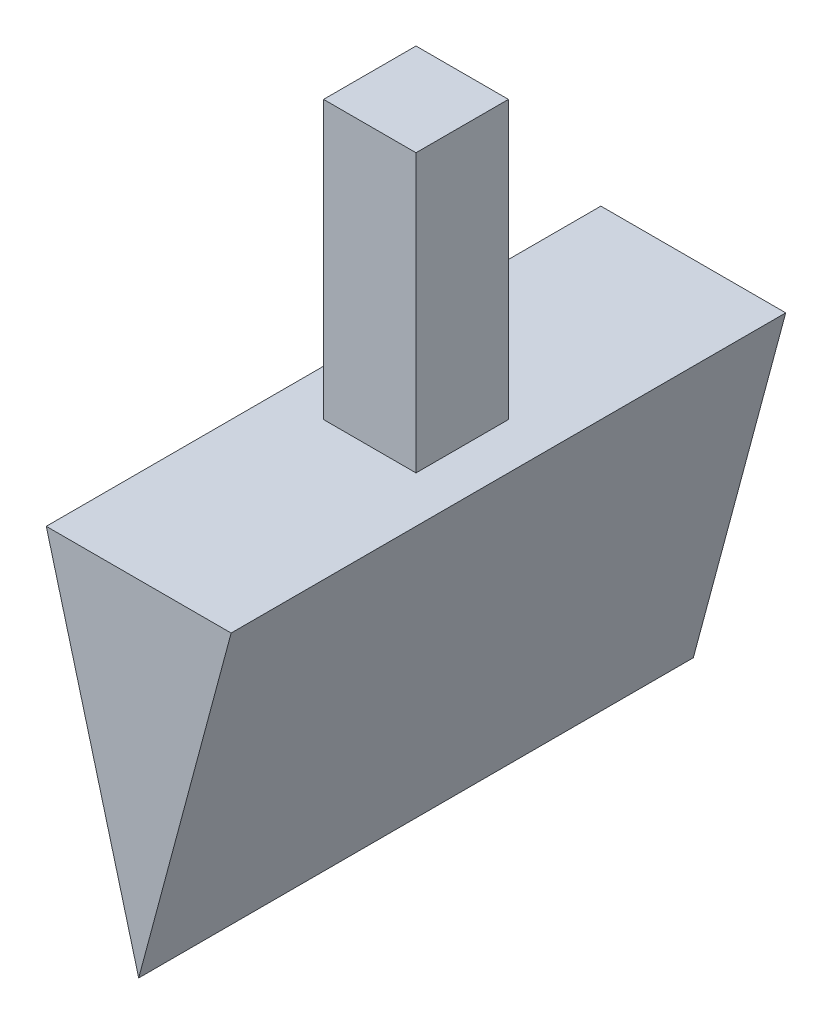
ISO-10303-21;
HEADER;
FILE_DESCRIPTION(('STEP AP214'),'2;1');
FILE_NAME('part.step','',(''),(''),'','','');
FILE_SCHEMA(('AUTOMOTIVE_DESIGN { 1 0 10303 214 1 1 1 1 }'));
ENDSEC;
DATA;
#1=APPLICATION_CONTEXT('core data for automotive mechanical design processes');
#2=APPLICATION_PROTOCOL_DEFINITION('international standard','automotive_design',2000,#1);
#3=PRODUCT_CONTEXT('',#1,'mechanical');
#4=PRODUCT('Part','Part','',(#3));
#5=PRODUCT_RELATED_PRODUCT_CATEGORY('part','',(#4));
#6=PRODUCT_DEFINITION_FORMATION('','',#4);
#7=PRODUCT_DEFINITION_CONTEXT('part definition',#1,'design');
#8=PRODUCT_DEFINITION('design','',#6,#7);
#9=PRODUCT_DEFINITION_SHAPE('','',#8);
#10=(LENGTH_UNIT() NAMED_UNIT(*) SI_UNIT(.MILLI.,.METRE.));
#11=(NAMED_UNIT(*) PLANE_ANGLE_UNIT() SI_UNIT($,.RADIAN.));
#12=(NAMED_UNIT(*) SI_UNIT($,.STERADIAN.) SOLID_ANGLE_UNIT());
#13=UNCERTAINTY_MEASURE_WITH_UNIT(LENGTH_MEASURE(1.E-05),#10,'distance_accuracy_value','');
#14=(GEOMETRIC_REPRESENTATION_CONTEXT(3) GLOBAL_UNCERTAINTY_ASSIGNED_CONTEXT((#13)) GLOBAL_UNIT_ASSIGNED_CONTEXT((#10,
#11,#12)) REPRESENTATION_CONTEXT('',''));
#15=CARTESIAN_POINT('',(0.,0.,0.));
#16=DIRECTION('',(0.,0.,1.));
#17=DIRECTION('',(1.,0.,0.));
#18=AXIS2_PLACEMENT_3D('',#15,#16,#17);
#19=CARTESIAN_POINT('',(-2.00000000000003,7.46410161513773,12.));
#20=DIRECTION('',(0.,-1.,0.));
#21=DIRECTION('',(0.,0.,-1.));
#22=AXIS2_PLACEMENT_3D('',#19,#20,#21);
#23=PLANE('',#22);
#24=DIRECTION('',(-1.,0.,0.));
#25=VECTOR('',#24,1.);
#26=CARTESIAN_POINT('',(-2.00000000000003,7.46410161513773,0.));
#27=LINE('',#26,#25);
#28=CARTESIAN_POINT('',(1.99999999999997,7.46410161513773,0.));
#29=VERTEX_POINT('',#28);
#30=CARTESIAN_POINT('',(-2.00000000000003,7.46410161513773,0.));
#31=VERTEX_POINT('',#30);
#32=EDGE_CURVE('E114',#29,#31,#27,.T.);
#33=ORIENTED_EDGE('',*,*,#32,.T.);
#34=DIRECTION('',(0.,0.,-1.));
#35=VECTOR('',#34,1.);
#36=CARTESIAN_POINT('',(-2.00000000000003,7.46410161513773,12.));
#37=LINE('',#36,#35);
#38=CARTESIAN_POINT('',(-2.00000000000003,7.46410161513773,12.));
#39=VERTEX_POINT('',#38);
#40=EDGE_CURVE('E39',#39,#31,#37,.T.);
#41=ORIENTED_EDGE('',*,*,#40,.F.);
#42=DIRECTION('',(-1.,0.,0.));
#43=VECTOR('',#42,1.);
#44=CARTESIAN_POINT('',(-2.00000000000003,7.46410161513773,12.));
#45=LINE('',#44,#43);
#46=CARTESIAN_POINT('',(1.99999999999997,7.46410161513773,12.));
#47=VERTEX_POINT('',#46);
#48=EDGE_CURVE('E123',#47,#39,#45,.T.);
#49=ORIENTED_EDGE('',*,*,#48,.F.);
#50=DIRECTION('',(0.,0.,-1.));
#51=VECTOR('',#50,1.);
#52=CARTESIAN_POINT('',(1.99999999999997,7.46410161513773,12.));
#53=LINE('',#52,#51);
#54=EDGE_CURVE('E11',#47,#29,#53,.T.);
#55=ORIENTED_EDGE('',*,*,#54,.T.);
#56=EDGE_LOOP('',(#33,#41,#49,#55));
#57=FACE_BOUND('',#56,.T.);
#58=DIRECTION('',(0.,0.,-1.));
#59=VECTOR('',#58,1.);
#60=CARTESIAN_POINT('',(0.99999999999997,7.46410161513773,7.));
#61=LINE('',#60,#59);
#62=CARTESIAN_POINT('',(0.99999999999997,7.46410161513773,7.));
#63=VERTEX_POINT('',#62);
#64=CARTESIAN_POINT('',(0.99999999999997,7.46410161513773,5.));
#65=VERTEX_POINT('',#64);
#66=EDGE_CURVE('E110',#63,#65,#61,.T.);
#67=ORIENTED_EDGE('',*,*,#66,.F.);
#68=DIRECTION('',(1.,0.,0.));
#69=VECTOR('',#68,1.);
#70=CARTESIAN_POINT('',(0.99999999999997,7.46410161513773,7.));
#71=LINE('',#70,#69);
#72=CARTESIAN_POINT('',(-1.00000000000003,7.46410161513773,7.));
#73=VERTEX_POINT('',#72);
#74=EDGE_CURVE('E107',#73,#63,#71,.T.);
#75=ORIENTED_EDGE('',*,*,#74,.F.);
#76=DIRECTION('',(0.,0.,1.));
#77=VECTOR('',#76,1.);
#78=CARTESIAN_POINT('',(-1.00000000000003,7.46410161513773,7.));
#79=LINE('',#78,#77);
#80=CARTESIAN_POINT('',(-1.00000000000003,7.46410161513773,5.));
#81=VERTEX_POINT('',#80);
#82=EDGE_CURVE('E51',#81,#73,#79,.T.);
#83=ORIENTED_EDGE('',*,*,#82,.F.);
#84=DIRECTION('',(-1.,0.,0.));
#85=VECTOR('',#84,1.);
#86=CARTESIAN_POINT('',(0.99999999999997,7.46410161513773,5.));
#87=LINE('',#86,#85);
#88=EDGE_CURVE('E46',#65,#81,#87,.T.);
#89=ORIENTED_EDGE('',*,*,#88,.F.);
#90=EDGE_LOOP('',(#67,#75,#83,#89));
#91=FACE_BOUND('',#90,.T.);
#92=ADVANCED_FACE('F31',(#57,#91),#23,.F.);
#93=CARTESIAN_POINT('',(0.,0.,12.));
#94=DIRECTION('',(-0.965925826289069,0.258819045102518,0.));
#95=DIRECTION('',(-0.258819045102518,-0.965925826289069,0.));
#96=AXIS2_PLACEMENT_3D('',#93,#94,#95);
#97=PLANE('',#96);
#98=DIRECTION('',(0.258819045102518,0.965925826289069,0.));
#99=VECTOR('',#98,1.);
#100=CARTESIAN_POINT('',(0.,0.,0.));
#101=LINE('',#100,#99);
#102=CARTESIAN_POINT('',(0.,0.,0.));
#103=VERTEX_POINT('',#102);
#104=EDGE_CURVE('E111',#103,#29,#101,.T.);
#105=ORIENTED_EDGE('',*,*,#104,.T.);
#106=ORIENTED_EDGE('',*,*,#54,.F.);
#107=DIRECTION('',(0.258819045102518,0.965925826289069,0.));
#108=VECTOR('',#107,1.);
#109=CARTESIAN_POINT('',(0.,0.,12.));
#110=LINE('',#109,#108);
#111=CARTESIAN_POINT('',(0.,0.,12.));
#112=VERTEX_POINT('',#111);
#113=EDGE_CURVE('E120',#112,#47,#110,.T.);
#114=ORIENTED_EDGE('',*,*,#113,.F.);
#115=DIRECTION('',(0.,0.,-1.));
#116=VECTOR('',#115,1.);
#117=CARTESIAN_POINT('',(0.,0.,12.));
#118=LINE('',#117,#116);
#119=EDGE_CURVE('E127',#112,#103,#118,.T.);
#120=ORIENTED_EDGE('',*,*,#119,.T.);
#121=EDGE_LOOP('',(#105,#106,#114,#120));
#122=FACE_BOUND('',#121,.T.);
#123=ADVANCED_FACE('F33',(#122),#97,.F.);
#124=CARTESIAN_POINT('',(0.,0.,12.));
#125=DIRECTION('',(0.965925826289067,0.258819045102525,0.));
#126=DIRECTION('',(-0.258819045102525,0.965925826289067,0.));
#127=AXIS2_PLACEMENT_3D('',#124,#125,#126);
#128=PLANE('',#127);
#129=DIRECTION('',(0.258819045102525,-0.965925826289067,0.));
#130=VECTOR('',#129,1.);
#131=CARTESIAN_POINT('',(0.,0.,0.));
#132=LINE('',#131,#130);
#133=EDGE_CURVE('E124',#31,#103,#132,.T.);
#134=ORIENTED_EDGE('',*,*,#133,.T.);
#135=ORIENTED_EDGE('',*,*,#119,.F.);
#136=DIRECTION('',(0.258819045102525,-0.965925826289067,0.));
#137=VECTOR('',#136,1.);
#138=CARTESIAN_POINT('',(0.,0.,12.));
#139=LINE('',#138,#137);
#140=EDGE_CURVE('E126',#39,#112,#139,.T.);
#141=ORIENTED_EDGE('',*,*,#140,.F.);
#142=ORIENTED_EDGE('',*,*,#40,.T.);
#143=EDGE_LOOP('',(#134,#135,#141,#142));
#144=FACE_BOUND('',#143,.T.);
#145=ADVANCED_FACE('F137',(#144),#128,.F.);
#146=CARTESIAN_POINT('',(1.99999999999997,7.46410161513773,12.));
#147=DIRECTION('',(0.,0.,-1.));
#148=DIRECTION('',(-1.,0.,0.));
#149=AXIS2_PLACEMENT_3D('',#146,#147,#148);
#150=PLANE('',#149);
#151=ORIENTED_EDGE('',*,*,#113,.T.);
#152=ORIENTED_EDGE('',*,*,#48,.T.);
#153=ORIENTED_EDGE('',*,*,#140,.T.);
#154=EDGE_LOOP('',(#151,#152,#153));
#155=FACE_BOUND('',#154,.T.);
#156=ADVANCED_FACE('F147',(#155),#150,.F.);
#157=CARTESIAN_POINT('',(1.99999999999997,7.46410161513773,0.));
#158=DIRECTION('',(0.,0.,-1.));
#159=DIRECTION('',(-1.,0.,0.));
#160=AXIS2_PLACEMENT_3D('',#157,#158,#159);
#161=PLANE('',#160);
#162=ORIENTED_EDGE('',*,*,#104,.F.);
#163=ORIENTED_EDGE('',*,*,#133,.F.);
#164=ORIENTED_EDGE('',*,*,#32,.F.);
#165=EDGE_LOOP('',(#162,#163,#164));
#166=FACE_BOUND('',#165,.T.);
#167=ADVANCED_FACE('F142',(#166),#161,.T.);
#168=CARTESIAN_POINT('',(0.99999999999997,13.4641016151377,7.));
#169=DIRECTION('',(-1.,0.,0.));
#170=DIRECTION('',(0.,0.,1.));
#171=AXIS2_PLACEMENT_3D('',#168,#169,#170);
#172=PLANE('',#171);
#173=ORIENTED_EDGE('',*,*,#66,.T.);
#174=DIRECTION('',(0.,-1.,0.));
#175=VECTOR('',#174,1.);
#176=CARTESIAN_POINT('',(0.99999999999997,13.4641016151377,5.));
#177=LINE('',#176,#175);
#178=CARTESIAN_POINT('',(0.99999999999997,13.4641016151377,5.));
#179=VERTEX_POINT('',#178);
#180=EDGE_CURVE('E91',#179,#65,#177,.T.);
#181=ORIENTED_EDGE('',*,*,#180,.F.);
#182=DIRECTION('',(0.,0.,-1.));
#183=VECTOR('',#182,1.);
#184=CARTESIAN_POINT('',(0.99999999999997,13.4641016151377,7.));
#185=LINE('',#184,#183);
#186=CARTESIAN_POINT('',(0.99999999999997,13.4641016151377,7.));
#187=VERTEX_POINT('',#186);
#188=EDGE_CURVE('E98',#187,#179,#185,.T.);
#189=ORIENTED_EDGE('',*,*,#188,.F.);
#190=DIRECTION('',(0.,-1.,0.));
#191=VECTOR('',#190,1.);
#192=CARTESIAN_POINT('',(0.99999999999997,13.4641016151377,7.));
#193=LINE('',#192,#191);
#194=EDGE_CURVE('E154',#187,#63,#193,.T.);
#195=ORIENTED_EDGE('',*,*,#194,.T.);
#196=EDGE_LOOP('',(#173,#181,#189,#195));
#197=FACE_BOUND('',#196,.T.);
#198=ADVANCED_FACE('F109',(#197),#172,.F.);
#199=CARTESIAN_POINT('',(0.99999999999997,13.4641016151377,5.));
#200=DIRECTION('',(0.,0.,1.));
#201=DIRECTION('',(1.,0.,0.));
#202=AXIS2_PLACEMENT_3D('',#199,#200,#201);
#203=PLANE('',#202);
#204=ORIENTED_EDGE('',*,*,#88,.T.);
#205=DIRECTION('',(0.,-1.,0.));
#206=VECTOR('',#205,1.);
#207=CARTESIAN_POINT('',(-1.00000000000003,13.4641016151377,5.));
#208=LINE('',#207,#206);
#209=CARTESIAN_POINT('',(-1.00000000000003,13.4641016151377,5.));
#210=VERTEX_POINT('',#209);
#211=EDGE_CURVE('E94',#210,#81,#208,.T.);
#212=ORIENTED_EDGE('',*,*,#211,.F.);
#213=DIRECTION('',(-1.,0.,0.));
#214=VECTOR('',#213,1.);
#215=CARTESIAN_POINT('',(0.99999999999997,13.4641016151377,5.));
#216=LINE('',#215,#214);
#217=EDGE_CURVE('E87',#179,#210,#216,.T.);
#218=ORIENTED_EDGE('',*,*,#217,.F.);
#219=ORIENTED_EDGE('',*,*,#180,.T.);
#220=EDGE_LOOP('',(#204,#212,#218,#219));
#221=FACE_BOUND('',#220,.T.);
#222=ADVANCED_FACE('F89',(#221),#203,.F.);
#223=CARTESIAN_POINT('',(-1.00000000000003,13.4641016151377,7.));
#224=DIRECTION('',(1.,0.,0.));
#225=DIRECTION('',(0.,0.,-1.));
#226=AXIS2_PLACEMENT_3D('',#223,#224,#225);
#227=PLANE('',#226);
#228=ORIENTED_EDGE('',*,*,#82,.T.);
#229=DIRECTION('',(0.,-1.,0.));
#230=VECTOR('',#229,1.);
#231=CARTESIAN_POINT('',(-1.00000000000003,13.4641016151377,7.));
#232=LINE('',#231,#230);
#233=CARTESIAN_POINT('',(-1.00000000000003,13.4641016151377,7.));
#234=VERTEX_POINT('',#233);
#235=EDGE_CURVE('E116',#234,#73,#232,.T.);
#236=ORIENTED_EDGE('',*,*,#235,.F.);
#237=DIRECTION('',(0.,0.,1.));
#238=VECTOR('',#237,1.);
#239=CARTESIAN_POINT('',(-1.00000000000003,13.4641016151377,7.));
#240=LINE('',#239,#238);
#241=EDGE_CURVE('E97',#210,#234,#240,.T.);
#242=ORIENTED_EDGE('',*,*,#241,.F.);
#243=ORIENTED_EDGE('',*,*,#211,.T.);
#244=EDGE_LOOP('',(#228,#236,#242,#243));
#245=FACE_BOUND('',#244,.T.);
#246=ADVANCED_FACE('F163',(#245),#227,.F.);
#247=CARTESIAN_POINT('',(0.99999999999997,13.4641016151377,7.));
#248=DIRECTION('',(0.,0.,-1.));
#249=DIRECTION('',(-1.,0.,0.));
#250=AXIS2_PLACEMENT_3D('',#247,#248,#249);
#251=PLANE('',#250);
#252=ORIENTED_EDGE('',*,*,#74,.T.);
#253=ORIENTED_EDGE('',*,*,#194,.F.);
#254=DIRECTION('',(1.,0.,0.));
#255=VECTOR('',#254,1.);
#256=CARTESIAN_POINT('',(0.99999999999997,13.4641016151377,7.));
#257=LINE('',#256,#255);
#258=EDGE_CURVE('E103',#234,#187,#257,.T.);
#259=ORIENTED_EDGE('',*,*,#258,.F.);
#260=ORIENTED_EDGE('',*,*,#235,.T.);
#261=EDGE_LOOP('',(#252,#253,#259,#260));
#262=FACE_BOUND('',#261,.T.);
#263=ADVANCED_FACE('F153',(#262),#251,.F.);
#264=CARTESIAN_POINT('',(0.99999999999997,13.4641016151377,5.));
#265=DIRECTION('',(0.,1.,0.));
#266=DIRECTION('',(0.,0.,1.));
#267=AXIS2_PLACEMENT_3D('',#264,#265,#266);
#268=PLANE('',#267);
#269=ORIENTED_EDGE('',*,*,#188,.T.);
#270=ORIENTED_EDGE('',*,*,#217,.T.);
#271=ORIENTED_EDGE('',*,*,#241,.T.);
#272=ORIENTED_EDGE('',*,*,#258,.T.);
#273=EDGE_LOOP('',(#269,#270,#271,#272));
#274=FACE_BOUND('',#273,.T.);
#275=ADVANCED_FACE('F101',(#274),#268,.T.);
#276=CLOSED_SHELL('',(#92,#123,#145,#156,#167,#198,#222,#246,#263,#275));
#277=MANIFOLD_SOLID_BREP('B2',#276);
#278=ADVANCED_BREP_SHAPE_REPRESENTATION('',(#18,#277),#14);
#279=SHAPE_DEFINITION_REPRESENTATION(#9,#278);
ENDSEC;
END-ISO-10303-21;
